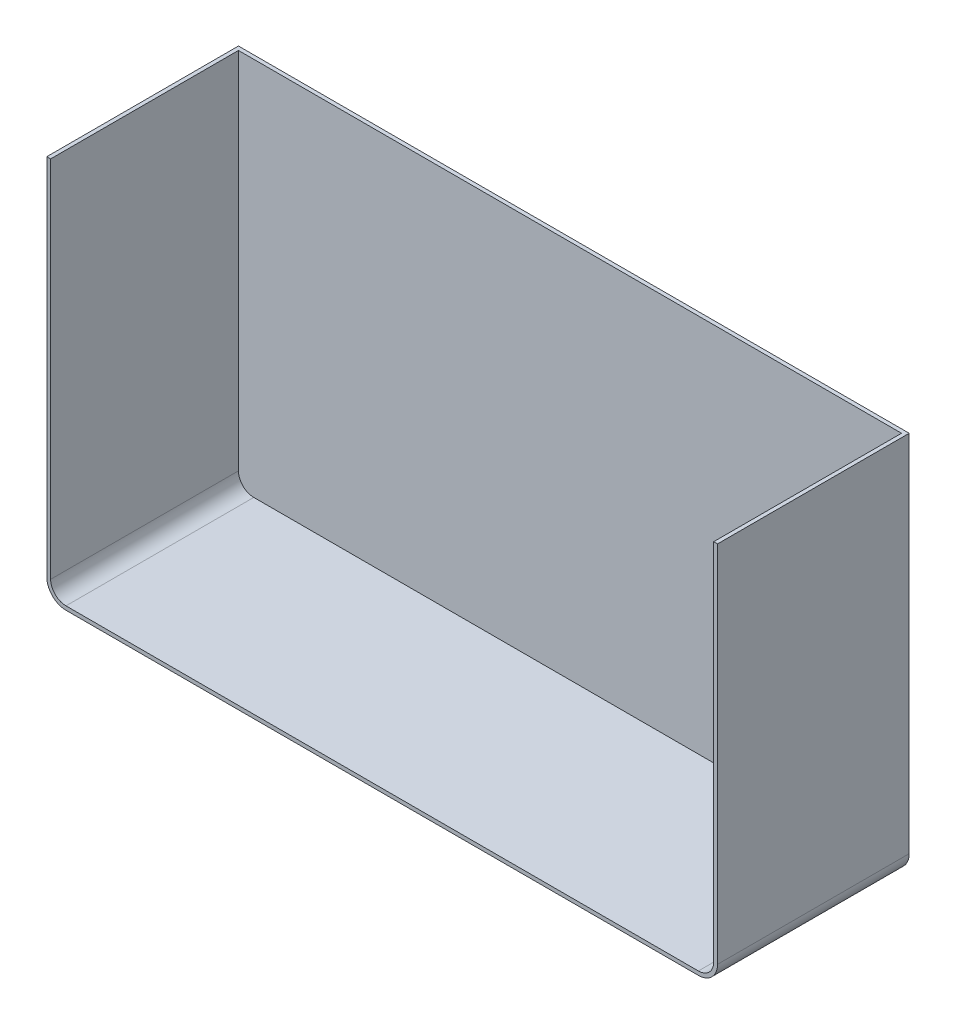
ISO-10303-21;
HEADER;
FILE_DESCRIPTION(('STEP AP214'),'2;1');
FILE_NAME('part.step','',(''),(''),'','','');
FILE_SCHEMA(('AUTOMOTIVE_DESIGN { 1 0 10303 214 1 1 1 1 }'));
ENDSEC;
DATA;
#1=APPLICATION_CONTEXT('core data for automotive mechanical design processes');
#2=APPLICATION_PROTOCOL_DEFINITION('international standard','automotive_design',2000,#1);
#3=PRODUCT_CONTEXT('',#1,'mechanical');
#4=PRODUCT('Part','Part','',(#3));
#5=PRODUCT_RELATED_PRODUCT_CATEGORY('part','',(#4));
#6=PRODUCT_DEFINITION_FORMATION('','',#4);
#7=PRODUCT_DEFINITION_CONTEXT('part definition',#1,'design');
#8=PRODUCT_DEFINITION('design','',#6,#7);
#9=PRODUCT_DEFINITION_SHAPE('','',#8);
#10=(LENGTH_UNIT() NAMED_UNIT(*) SI_UNIT(.MILLI.,.METRE.));
#11=(NAMED_UNIT(*) PLANE_ANGLE_UNIT() SI_UNIT($,.RADIAN.));
#12=(NAMED_UNIT(*) SI_UNIT($,.STERADIAN.) SOLID_ANGLE_UNIT());
#13=UNCERTAINTY_MEASURE_WITH_UNIT(LENGTH_MEASURE(1.E-05),#10,'distance_accuracy_value','');
#14=(GEOMETRIC_REPRESENTATION_CONTEXT(3) GLOBAL_UNCERTAINTY_ASSIGNED_CONTEXT((#13)) GLOBAL_UNIT_ASSIGNED_CONTEXT((#10,
#11,#12)) REPRESENTATION_CONTEXT('',''));
#15=CARTESIAN_POINT('',(0.,0.,0.));
#16=DIRECTION('',(0.,0.,1.));
#17=DIRECTION('',(1.,0.,0.));
#18=AXIS2_PLACEMENT_3D('',#15,#16,#17);
#19=CARTESIAN_POINT('',(175.,-100.,100.));
#20=DIRECTION('',(-1.,0.,0.));
#21=DIRECTION('',(0.,0.,1.));
#22=AXIS2_PLACEMENT_3D('',#19,#20,#21);
#23=PLANE('',#22);
#24=DIRECTION('',(0.,1.,0.));
#25=VECTOR('',#24,1.);
#26=CARTESIAN_POINT('',(175.,-100.,100.));
#27=LINE('',#26,#25);
#28=CARTESIAN_POINT('',(175.,-90.,100.));
#29=VERTEX_POINT('',#28);
#30=CARTESIAN_POINT('',(175.,100.,100.));
#31=VERTEX_POINT('',#30);
#32=EDGE_CURVE('E178',#29,#31,#27,.T.);
#33=ORIENTED_EDGE('',*,*,#32,.F.);
#34=DIRECTION('',(0.,0.,-1.));
#35=VECTOR('',#34,1.);
#36=CARTESIAN_POINT('',(175.,-90.,100.));
#37=LINE('',#36,#35);
#38=CARTESIAN_POINT('',(175.,-90.,0.));
#39=VERTEX_POINT('',#38);
#40=EDGE_CURVE('E204',#29,#39,#37,.T.);
#41=ORIENTED_EDGE('',*,*,#40,.T.);
#42=DIRECTION('',(0.,1.,0.));
#43=VECTOR('',#42,1.);
#44=CARTESIAN_POINT('',(175.,-100.,0.));
#45=LINE('',#44,#43);
#46=CARTESIAN_POINT('',(175.,100.,0.));
#47=VERTEX_POINT('',#46);
#48=EDGE_CURVE('E191',#39,#47,#45,.T.);
#49=ORIENTED_EDGE('',*,*,#48,.T.);
#50=DIRECTION('',(0.,0.,-1.));
#51=VECTOR('',#50,1.);
#52=CARTESIAN_POINT('',(175.,100.,100.));
#53=LINE('',#52,#51);
#54=EDGE_CURVE('E201',#31,#47,#53,.T.);
#55=ORIENTED_EDGE('',*,*,#54,.F.);
#56=EDGE_LOOP('',(#33,#41,#49,#55));
#57=FACE_BOUND('',#56,.T.);
#58=ADVANCED_FACE('F41',(#57),#23,.F.);
#59=CARTESIAN_POINT('',(-175.,100.,100.));
#60=DIRECTION('',(0.,-1.,0.));
#61=DIRECTION('',(0.,0.,-1.));
#62=AXIS2_PLACEMENT_3D('',#59,#60,#61);
#63=PLANE('',#62);
#64=DIRECTION('',(-1.,0.,0.));
#65=VECTOR('',#64,1.);
#66=CARTESIAN_POINT('',(-175.,100.,100.));
#67=LINE('',#66,#65);
#68=CARTESIAN_POINT('',(-173.,100.,100.));
#69=VERTEX_POINT('',#68);
#70=CARTESIAN_POINT('',(-175.,100.,100.));
#71=VERTEX_POINT('',#70);
#72=EDGE_CURVE('E180',#69,#71,#67,.T.);
#73=ORIENTED_EDGE('',*,*,#72,.F.);
#74=DIRECTION('',(0.,0.,-1.));
#75=VECTOR('',#74,1.);
#76=CARTESIAN_POINT('',(-173.,100.,100.));
#77=LINE('',#76,#75);
#78=CARTESIAN_POINT('',(-173.,100.,2.));
#79=VERTEX_POINT('',#78);
#80=EDGE_CURVE('E168',#69,#79,#77,.T.);
#81=ORIENTED_EDGE('',*,*,#80,.T.);
#82=DIRECTION('',(-1.,0.,0.));
#83=VECTOR('',#82,1.);
#84=CARTESIAN_POINT('',(0.,100.,2.));
#85=LINE('',#84,#83);
#86=CARTESIAN_POINT('',(173.,100.,2.));
#87=VERTEX_POINT('',#86);
#88=EDGE_CURVE('E169',#87,#79,#85,.T.);
#89=ORIENTED_EDGE('',*,*,#88,.F.);
#90=DIRECTION('',(0.,0.,-1.));
#91=VECTOR('',#90,1.);
#92=CARTESIAN_POINT('',(173.,100.,100.));
#93=LINE('',#92,#91);
#94=CARTESIAN_POINT('',(173.,100.,100.));
#95=VERTEX_POINT('',#94);
#96=EDGE_CURVE('E165',#95,#87,#93,.T.);
#97=ORIENTED_EDGE('',*,*,#96,.F.);
#98=EDGE_CURVE('E182',#31,#95,#67,.T.);
#99=ORIENTED_EDGE('',*,*,#98,.F.);
#100=ORIENTED_EDGE('',*,*,#54,.T.);
#101=DIRECTION('',(-1.,0.,0.));
#102=VECTOR('',#101,1.);
#103=CARTESIAN_POINT('',(-175.,100.,0.));
#104=LINE('',#103,#102);
#105=CARTESIAN_POINT('',(-175.,100.,0.));
#106=VERTEX_POINT('',#105);
#107=EDGE_CURVE('E193',#47,#106,#104,.T.);
#108=ORIENTED_EDGE('',*,*,#107,.T.);
#109=DIRECTION('',(0.,0.,-1.));
#110=VECTOR('',#109,1.);
#111=CARTESIAN_POINT('',(-175.,100.,100.));
#112=LINE('',#111,#110);
#113=EDGE_CURVE('E190',#71,#106,#112,.T.);
#114=ORIENTED_EDGE('',*,*,#113,.F.);
#115=EDGE_LOOP('',(#73,#81,#89,#97,#99,#100,#108,#114));
#116=FACE_BOUND('',#115,.T.);
#117=ADVANCED_FACE('F245',(#116),#63,.F.);
#118=CARTESIAN_POINT('',(-175.,-100.,100.));
#119=DIRECTION('',(1.,0.,0.));
#120=DIRECTION('',(0.,0.,-1.));
#121=AXIS2_PLACEMENT_3D('',#118,#119,#120);
#122=PLANE('',#121);
#123=DIRECTION('',(0.,-1.,0.));
#124=VECTOR('',#123,1.);
#125=CARTESIAN_POINT('',(-175.,-100.,0.));
#126=LINE('',#125,#124);
#127=CARTESIAN_POINT('',(-175.,-90.,0.));
#128=VERTEX_POINT('',#127);
#129=EDGE_CURVE('E195',#106,#128,#126,.T.);
#130=ORIENTED_EDGE('',*,*,#129,.T.);
#131=DIRECTION('',(0.,0.,-1.));
#132=VECTOR('',#131,1.);
#133=CARTESIAN_POINT('',(-175.,-90.,100.));
#134=LINE('',#133,#132);
#135=CARTESIAN_POINT('',(-175.,-90.,100.));
#136=VERTEX_POINT('',#135);
#137=EDGE_CURVE('E11',#128,#136,#134,.F.);
#138=ORIENTED_EDGE('',*,*,#137,.T.);
#139=DIRECTION('',(0.,-1.,0.));
#140=VECTOR('',#139,1.);
#141=CARTESIAN_POINT('',(-175.,-100.,100.));
#142=LINE('',#141,#140);
#143=EDGE_CURVE('E185',#71,#136,#142,.T.);
#144=ORIENTED_EDGE('',*,*,#143,.F.);
#145=ORIENTED_EDGE('',*,*,#113,.T.);
#146=EDGE_LOOP('',(#130,#138,#144,#145));
#147=FACE_BOUND('',#146,.T.);
#148=ADVANCED_FACE('F241',(#147),#122,.F.);
#149=CARTESIAN_POINT('',(-175.,-100.,100.));
#150=DIRECTION('',(0.,1.,0.));
#151=DIRECTION('',(0.,0.,1.));
#152=AXIS2_PLACEMENT_3D('',#149,#150,#151);
#153=PLANE('',#152);
#154=DIRECTION('',(1.,0.,0.));
#155=VECTOR('',#154,1.);
#156=CARTESIAN_POINT('',(-175.,-100.,0.));
#157=LINE('',#156,#155);
#158=CARTESIAN_POINT('',(-165.,-100.,0.));
#159=VERTEX_POINT('',#158);
#160=CARTESIAN_POINT('',(165.,-100.,0.));
#161=VERTEX_POINT('',#160);
#162=EDGE_CURVE('E181',#159,#161,#157,.T.);
#163=ORIENTED_EDGE('',*,*,#162,.T.);
#164=DIRECTION('',(0.,0.,-1.));
#165=VECTOR('',#164,1.);
#166=CARTESIAN_POINT('',(165.,-100.,100.));
#167=LINE('',#166,#165);
#168=CARTESIAN_POINT('',(165.,-100.,100.));
#169=VERTEX_POINT('',#168);
#170=EDGE_CURVE('E214',#161,#169,#167,.F.);
#171=ORIENTED_EDGE('',*,*,#170,.T.);
#172=DIRECTION('',(1.,0.,0.));
#173=VECTOR('',#172,1.);
#174=CARTESIAN_POINT('',(-175.,-100.,100.));
#175=LINE('',#174,#173);
#176=CARTESIAN_POINT('',(-165.,-100.,100.));
#177=VERTEX_POINT('',#176);
#178=EDGE_CURVE('E187',#177,#169,#175,.T.);
#179=ORIENTED_EDGE('',*,*,#178,.F.);
#180=DIRECTION('',(0.,0.,-1.));
#181=VECTOR('',#180,1.);
#182=CARTESIAN_POINT('',(-165.,-100.,100.));
#183=LINE('',#182,#181);
#184=EDGE_CURVE('E211',#177,#159,#183,.T.);
#185=ORIENTED_EDGE('',*,*,#184,.T.);
#186=EDGE_LOOP('',(#163,#171,#179,#185));
#187=FACE_BOUND('',#186,.T.);
#188=ADVANCED_FACE('F236',(#187),#153,.F.);
#189=CARTESIAN_POINT('',(0.,0.,100.));
#190=DIRECTION('',(0.,0.,-1.));
#191=DIRECTION('',(-1.,0.,0.));
#192=AXIS2_PLACEMENT_3D('',#189,#190,#191);
#193=PLANE('',#192);
#194=DIRECTION('',(0.,1.,0.));
#195=VECTOR('',#194,1.);
#196=CARTESIAN_POINT('',(173.,0.,100.));
#197=LINE('',#196,#195);
#198=CARTESIAN_POINT('',(173.,-90.,100.));
#199=VERTEX_POINT('',#198);
#200=EDGE_CURVE('E150',#199,#95,#197,.T.);
#201=ORIENTED_EDGE('',*,*,#200,.F.);
#202=CARTESIAN_POINT('',(165.,-90.,100.));
#203=DIRECTION('',(0.,0.,-1.));
#204=DIRECTION('',(-1.,0.,0.));
#205=AXIS2_PLACEMENT_3D('',#202,#203,#204);
#206=CIRCLE('',#205,8.);
#207=CARTESIAN_POINT('',(165.,-98.,100.));
#208=VERTEX_POINT('',#207);
#209=EDGE_CURVE('E159',#208,#199,#206,.F.);
#210=ORIENTED_EDGE('',*,*,#209,.F.);
#211=DIRECTION('',(1.,0.,0.));
#212=VECTOR('',#211,1.);
#213=CARTESIAN_POINT('',(0.,-98.,100.));
#214=LINE('',#213,#212);
#215=CARTESIAN_POINT('',(-165.,-98.,100.));
#216=VERTEX_POINT('',#215);
#217=EDGE_CURVE('E155',#216,#208,#214,.T.);
#218=ORIENTED_EDGE('',*,*,#217,.F.);
#219=CARTESIAN_POINT('',(-165.,-90.,100.));
#220=DIRECTION('',(0.,0.,-1.));
#221=DIRECTION('',(-1.,0.,0.));
#222=AXIS2_PLACEMENT_3D('',#219,#220,#221);
#223=CIRCLE('',#222,8.);
#224=CARTESIAN_POINT('',(-173.,-90.,100.));
#225=VERTEX_POINT('',#224);
#226=EDGE_CURVE('E157',#225,#216,#223,.F.);
#227=ORIENTED_EDGE('',*,*,#226,.F.);
#228=DIRECTION('',(0.,-1.,0.));
#229=VECTOR('',#228,1.);
#230=CARTESIAN_POINT('',(-173.,0.,100.));
#231=LINE('',#230,#229);
#232=EDGE_CURVE('E56',#69,#225,#231,.T.);
#233=ORIENTED_EDGE('',*,*,#232,.F.);
#234=ORIENTED_EDGE('',*,*,#72,.T.);
#235=ORIENTED_EDGE('',*,*,#143,.T.);
#236=CARTESIAN_POINT('',(-165.,-90.,100.));
#237=DIRECTION('',(0.,0.,-1.));
#238=DIRECTION('',(-1.,0.,0.));
#239=AXIS2_PLACEMENT_3D('',#236,#237,#238);
#240=CIRCLE('',#239,10.);
#241=EDGE_CURVE('E216',#136,#177,#240,.F.);
#242=ORIENTED_EDGE('',*,*,#241,.T.);
#243=ORIENTED_EDGE('',*,*,#178,.T.);
#244=CARTESIAN_POINT('',(165.,-90.,100.));
#245=DIRECTION('',(0.,0.,-1.));
#246=DIRECTION('',(-1.,0.,0.));
#247=AXIS2_PLACEMENT_3D('',#244,#245,#246);
#248=CIRCLE('',#247,10.);
#249=EDGE_CURVE('E49',#169,#29,#248,.F.);
#250=ORIENTED_EDGE('',*,*,#249,.T.);
#251=ORIENTED_EDGE('',*,*,#32,.T.);
#252=ORIENTED_EDGE('',*,*,#98,.T.);
#253=EDGE_LOOP('',(#201,#210,#218,#227,#233,#234,#235,#242,#243,#250,#251,#252));
#254=FACE_BOUND('',#253,.T.);
#255=ADVANCED_FACE('F221',(#254),#193,.F.);
#256=CARTESIAN_POINT('',(0.,0.,0.));
#257=DIRECTION('',(0.,0.,-1.));
#258=DIRECTION('',(-1.,0.,0.));
#259=AXIS2_PLACEMENT_3D('',#256,#257,#258);
#260=PLANE('',#259);
#261=ORIENTED_EDGE('',*,*,#48,.F.);
#262=CARTESIAN_POINT('',(165.,-90.,0.));
#263=DIRECTION('',(0.,0.,-1.));
#264=DIRECTION('',(-1.,0.,0.));
#265=AXIS2_PLACEMENT_3D('',#262,#263,#264);
#266=CIRCLE('',#265,10.);
#267=EDGE_CURVE('E209',#39,#161,#266,.T.);
#268=ORIENTED_EDGE('',*,*,#267,.T.);
#269=ORIENTED_EDGE('',*,*,#162,.F.);
#270=CARTESIAN_POINT('',(-165.,-90.,0.));
#271=DIRECTION('',(0.,0.,-1.));
#272=DIRECTION('',(-1.,0.,0.));
#273=AXIS2_PLACEMENT_3D('',#270,#271,#272);
#274=CIRCLE('',#273,10.);
#275=EDGE_CURVE('E207',#159,#128,#274,.T.);
#276=ORIENTED_EDGE('',*,*,#275,.T.);
#277=ORIENTED_EDGE('',*,*,#129,.F.);
#278=ORIENTED_EDGE('',*,*,#107,.F.);
#279=EDGE_LOOP('',(#261,#268,#269,#276,#277,#278));
#280=FACE_BOUND('',#279,.T.);
#281=ADVANCED_FACE('F233',(#280),#260,.T.);
#282=CARTESIAN_POINT('',(165.,-90.,100.));
#283=DIRECTION('',(0.,0.,-1.));
#284=DIRECTION('',(-1.,0.,0.));
#285=AXIS2_PLACEMENT_3D('',#282,#283,#284);
#286=CYLINDRICAL_SURFACE('',#285,10.);
#287=ORIENTED_EDGE('',*,*,#249,.F.);
#288=ORIENTED_EDGE('',*,*,#170,.F.);
#289=ORIENTED_EDGE('',*,*,#267,.F.);
#290=ORIENTED_EDGE('',*,*,#40,.F.);
#291=EDGE_LOOP('',(#287,#288,#289,#290));
#292=FACE_BOUND('',#291,.T.);
#293=ADVANCED_FACE('F230',(#292),#286,.T.);
#294=CARTESIAN_POINT('',(-165.,-90.,100.));
#295=DIRECTION('',(0.,0.,-1.));
#296=DIRECTION('',(-1.,0.,0.));
#297=AXIS2_PLACEMENT_3D('',#294,#295,#296);
#298=CYLINDRICAL_SURFACE('',#297,10.);
#299=ORIENTED_EDGE('',*,*,#241,.F.);
#300=ORIENTED_EDGE('',*,*,#137,.F.);
#301=ORIENTED_EDGE('',*,*,#275,.F.);
#302=ORIENTED_EDGE('',*,*,#184,.F.);
#303=EDGE_LOOP('',(#299,#300,#301,#302));
#304=FACE_BOUND('',#303,.T.);
#305=ADVANCED_FACE('F43',(#304),#298,.T.);
#306=CARTESIAN_POINT('',(173.,-100.,100.));
#307=DIRECTION('',(-1.,0.,0.));
#308=DIRECTION('',(0.,0.,1.));
#309=AXIS2_PLACEMENT_3D('',#306,#307,#308);
#310=PLANE('',#309);
#311=ORIENTED_EDGE('',*,*,#200,.T.);
#312=ORIENTED_EDGE('',*,*,#96,.T.);
#313=DIRECTION('',(0.,1.,0.));
#314=VECTOR('',#313,1.);
#315=CARTESIAN_POINT('',(173.,0.,2.));
#316=LINE('',#315,#314);
#317=CARTESIAN_POINT('',(173.,-90.,2.));
#318=VERTEX_POINT('',#317);
#319=EDGE_CURVE('E171',#318,#87,#316,.T.);
#320=ORIENTED_EDGE('',*,*,#319,.F.);
#321=DIRECTION('',(0.,0.,1.));
#322=VECTOR('',#321,1.);
#323=CARTESIAN_POINT('',(173.,-90.,100.));
#324=LINE('',#323,#322);
#325=EDGE_CURVE('E137',#199,#318,#324,.F.);
#326=ORIENTED_EDGE('',*,*,#325,.F.);
#327=EDGE_LOOP('',(#311,#312,#320,#326));
#328=FACE_BOUND('',#327,.T.);
#329=ADVANCED_FACE('F249',(#328),#310,.T.);
#330=CARTESIAN_POINT('',(-173.,-100.,100.));
#331=DIRECTION('',(1.,0.,0.));
#332=DIRECTION('',(0.,0.,-1.));
#333=AXIS2_PLACEMENT_3D('',#330,#331,#332);
#334=PLANE('',#333);
#335=DIRECTION('',(0.,-1.,0.));
#336=VECTOR('',#335,1.);
#337=CARTESIAN_POINT('',(-173.,0.,2.));
#338=LINE('',#337,#336);
#339=CARTESIAN_POINT('',(-173.,-90.,2.));
#340=VERTEX_POINT('',#339);
#341=EDGE_CURVE('E151',#79,#340,#338,.T.);
#342=ORIENTED_EDGE('',*,*,#341,.F.);
#343=ORIENTED_EDGE('',*,*,#80,.F.);
#344=ORIENTED_EDGE('',*,*,#232,.T.);
#345=DIRECTION('',(0.,0.,-1.));
#346=VECTOR('',#345,1.);
#347=CARTESIAN_POINT('',(-173.,-90.,100.));
#348=LINE('',#347,#346);
#349=EDGE_CURVE('E177',#340,#225,#348,.F.);
#350=ORIENTED_EDGE('',*,*,#349,.F.);
#351=EDGE_LOOP('',(#342,#343,#344,#350));
#352=FACE_BOUND('',#351,.T.);
#353=ADVANCED_FACE('F258',(#352),#334,.T.);
#354=CARTESIAN_POINT('',(-175.,-98.,100.));
#355=DIRECTION('',(0.,1.,0.));
#356=DIRECTION('',(0.,0.,1.));
#357=AXIS2_PLACEMENT_3D('',#354,#355,#356);
#358=PLANE('',#357);
#359=DIRECTION('',(1.,0.,0.));
#360=VECTOR('',#359,1.);
#361=CARTESIAN_POINT('',(0.,-98.,2.));
#362=LINE('',#361,#360);
#363=CARTESIAN_POINT('',(-165.,-98.,2.));
#364=VERTEX_POINT('',#363);
#365=CARTESIAN_POINT('',(165.,-98.,2.));
#366=VERTEX_POINT('',#365);
#367=EDGE_CURVE('E144',#364,#366,#362,.T.);
#368=ORIENTED_EDGE('',*,*,#367,.F.);
#369=DIRECTION('',(0.,0.,1.));
#370=VECTOR('',#369,1.);
#371=CARTESIAN_POINT('',(-165.,-98.,100.));
#372=LINE('',#371,#370);
#373=EDGE_CURVE('E140',#216,#364,#372,.F.);
#374=ORIENTED_EDGE('',*,*,#373,.F.);
#375=ORIENTED_EDGE('',*,*,#217,.T.);
#376=DIRECTION('',(0.,0.,1.));
#377=VECTOR('',#376,1.);
#378=CARTESIAN_POINT('',(165.,-98.,100.));
#379=LINE('',#378,#377);
#380=EDGE_CURVE('E134',#366,#208,#379,.T.);
#381=ORIENTED_EDGE('',*,*,#380,.F.);
#382=EDGE_LOOP('',(#368,#374,#375,#381));
#383=FACE_BOUND('',#382,.T.);
#384=ADVANCED_FACE('F153',(#383),#358,.T.);
#385=CARTESIAN_POINT('',(0.,0.,2.));
#386=DIRECTION('',(0.,0.,-1.));
#387=DIRECTION('',(-1.,0.,0.));
#388=AXIS2_PLACEMENT_3D('',#385,#386,#387);
#389=PLANE('',#388);
#390=ORIENTED_EDGE('',*,*,#319,.T.);
#391=ORIENTED_EDGE('',*,*,#88,.T.);
#392=ORIENTED_EDGE('',*,*,#341,.T.);
#393=CARTESIAN_POINT('',(-165.,-90.,2.));
#394=DIRECTION('',(0.,0.,-1.));
#395=DIRECTION('',(-1.,0.,0.));
#396=AXIS2_PLACEMENT_3D('',#393,#394,#395);
#397=CIRCLE('',#396,8.);
#398=EDGE_CURVE('E141',#364,#340,#397,.T.);
#399=ORIENTED_EDGE('',*,*,#398,.F.);
#400=ORIENTED_EDGE('',*,*,#367,.T.);
#401=CARTESIAN_POINT('',(165.,-90.,2.));
#402=DIRECTION('',(0.,0.,-1.));
#403=DIRECTION('',(-1.,0.,0.));
#404=AXIS2_PLACEMENT_3D('',#401,#402,#403);
#405=CIRCLE('',#404,8.);
#406=EDGE_CURVE('E130',#318,#366,#405,.T.);
#407=ORIENTED_EDGE('',*,*,#406,.F.);
#408=EDGE_LOOP('',(#390,#391,#392,#399,#400,#407));
#409=FACE_BOUND('',#408,.T.);
#410=ADVANCED_FACE('F145',(#409),#389,.F.);
#411=CARTESIAN_POINT('',(165.,-90.,100.));
#412=DIRECTION('',(0.,0.,-1.));
#413=DIRECTION('',(-1.,0.,0.));
#414=AXIS2_PLACEMENT_3D('',#411,#412,#413);
#415=CYLINDRICAL_SURFACE('',#414,8.);
#416=ORIENTED_EDGE('',*,*,#209,.T.);
#417=ORIENTED_EDGE('',*,*,#325,.T.);
#418=ORIENTED_EDGE('',*,*,#406,.T.);
#419=ORIENTED_EDGE('',*,*,#380,.T.);
#420=EDGE_LOOP('',(#416,#417,#418,#419));
#421=FACE_BOUND('',#420,.T.);
#422=ADVANCED_FACE('F132',(#421),#415,.F.);
#423=CARTESIAN_POINT('',(-165.,-90.,100.));
#424=DIRECTION('',(0.,0.,-1.));
#425=DIRECTION('',(-1.,0.,0.));
#426=AXIS2_PLACEMENT_3D('',#423,#424,#425);
#427=CYLINDRICAL_SURFACE('',#426,8.);
#428=ORIENTED_EDGE('',*,*,#226,.T.);
#429=ORIENTED_EDGE('',*,*,#373,.T.);
#430=ORIENTED_EDGE('',*,*,#398,.T.);
#431=ORIENTED_EDGE('',*,*,#349,.T.);
#432=EDGE_LOOP('',(#428,#429,#430,#431));
#433=FACE_BOUND('',#432,.T.);
#434=ADVANCED_FACE('F256',(#433),#427,.F.);
#435=CLOSED_SHELL('',(#58,#117,#148,#188,#255,#281,#293,#305,#329,#353,#384,#410,#422,#434));
#436=MANIFOLD_SOLID_BREP('B2',#435);
#437=ADVANCED_BREP_SHAPE_REPRESENTATION('',(#18,#436),#14);
#438=SHAPE_DEFINITION_REPRESENTATION(#9,#437);
ENDSEC;
END-ISO-10303-21;
